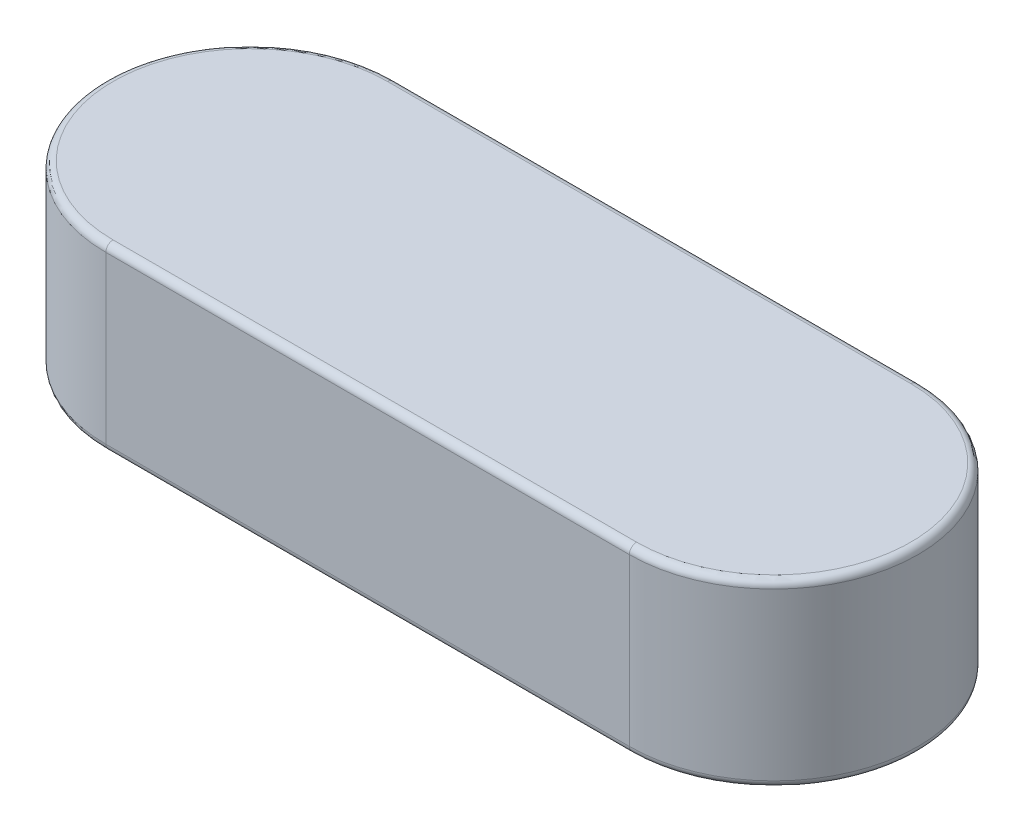
ISO-10303-21;
HEADER;
FILE_DESCRIPTION(('STEP AP214'),'2;1');
FILE_NAME('part.step','',(''),(''),'','','');
FILE_SCHEMA(('AUTOMOTIVE_DESIGN { 1 0 10303 214 1 1 1 1 }'));
ENDSEC;
DATA;
#1=APPLICATION_CONTEXT('core data for automotive mechanical design processes');
#2=APPLICATION_PROTOCOL_DEFINITION('international standard','automotive_design',2000,#1);
#3=PRODUCT_CONTEXT('',#1,'mechanical');
#4=PRODUCT('Part','Part','',(#3));
#5=PRODUCT_RELATED_PRODUCT_CATEGORY('part','',(#4));
#6=PRODUCT_DEFINITION_FORMATION('','',#4);
#7=PRODUCT_DEFINITION_CONTEXT('part definition',#1,'design');
#8=PRODUCT_DEFINITION('design','',#6,#7);
#9=PRODUCT_DEFINITION_SHAPE('','',#8);
#10=(LENGTH_UNIT() NAMED_UNIT(*) SI_UNIT(.MILLI.,.METRE.));
#11=(NAMED_UNIT(*) PLANE_ANGLE_UNIT() SI_UNIT($,.RADIAN.));
#12=(NAMED_UNIT(*) SI_UNIT($,.STERADIAN.) SOLID_ANGLE_UNIT());
#13=UNCERTAINTY_MEASURE_WITH_UNIT(LENGTH_MEASURE(1.E-05),#10,'distance_accuracy_value','');
#14=(GEOMETRIC_REPRESENTATION_CONTEXT(3) GLOBAL_UNCERTAINTY_ASSIGNED_CONTEXT((#13)) GLOBAL_UNIT_ASSIGNED_CONTEXT((#10,
#11,#12)) REPRESENTATION_CONTEXT('',''));
#15=CARTESIAN_POINT('',(0.,0.,0.));
#16=DIRECTION('',(0.,0.,1.));
#17=DIRECTION('',(1.,0.,0.));
#18=AXIS2_PLACEMENT_3D('',#15,#16,#17);
#19=CARTESIAN_POINT('',(-29.,10.,0.));
#20=DIRECTION('',(0.,-1.,0.));
#21=DIRECTION('',(0.,0.,-1.));
#22=AXIS2_PLACEMENT_3D('',#19,#20,#21);
#23=CYLINDRICAL_SURFACE('',#22,8.);
#24=DIRECTION('',(0.,-1.,0.));
#25=VECTOR('',#24,1.);
#26=CARTESIAN_POINT('',(-29.,10.,-8.));
#27=LINE('',#26,#25);
#28=CARTESIAN_POINT('',(-29.,9.6,-8.));
#29=VERTEX_POINT('',#28);
#30=CARTESIAN_POINT('',(-29.,0.399999999999999,-8.));
#31=VERTEX_POINT('',#30);
#32=EDGE_CURVE('E111',#29,#31,#27,.T.);
#33=ORIENTED_EDGE('',*,*,#32,.T.);
#34=CARTESIAN_POINT('',(-29.,0.399999999999999,0.));
#35=DIRECTION('',(0.,1.,0.));
#36=DIRECTION('',(0.,0.,1.));
#37=AXIS2_PLACEMENT_3D('',#34,#35,#36);
#38=CIRCLE('',#37,8.);
#39=CARTESIAN_POINT('',(-29.,0.399999999999999,8.));
#40=VERTEX_POINT('',#39);
#41=EDGE_CURVE('E119',#31,#40,#38,.T.);
#42=ORIENTED_EDGE('',*,*,#41,.T.);
#43=DIRECTION('',(0.,-1.,0.));
#44=VECTOR('',#43,1.);
#45=CARTESIAN_POINT('',(-29.,10.,8.));
#46=LINE('',#45,#44);
#47=CARTESIAN_POINT('',(-29.,9.6,8.));
#48=VERTEX_POINT('',#47);
#49=EDGE_CURVE('E113',#48,#40,#46,.T.);
#50=ORIENTED_EDGE('',*,*,#49,.F.);
#51=CARTESIAN_POINT('',(-29.,9.6,0.));
#52=DIRECTION('',(0.,1.,0.));
#53=DIRECTION('',(0.,0.,1.));
#54=AXIS2_PLACEMENT_3D('',#51,#52,#53);
#55=CIRCLE('',#54,8.);
#56=EDGE_CURVE('E109',#48,#29,#55,.F.);
#57=ORIENTED_EDGE('',*,*,#56,.T.);
#58=EDGE_LOOP('',(#33,#42,#50,#57));
#59=FACE_BOUND('',#58,.T.);
#60=ADVANCED_FACE('F39',(#59),#23,.T.);
#61=CARTESIAN_POINT('',(-29.,10.,8.));
#62=DIRECTION('',(0.,0.,-1.));
#63=DIRECTION('',(-1.,0.,0.));
#64=AXIS2_PLACEMENT_3D('',#61,#62,#63);
#65=PLANE('',#64);
#66=ORIENTED_EDGE('',*,*,#49,.T.);
#67=DIRECTION('',(1.,0.,0.));
#68=VECTOR('',#67,1.);
#69=CARTESIAN_POINT('',(-29.,0.399999999999999,8.));
#70=LINE('',#69,#68);
#71=CARTESIAN_POINT('',(0.,0.399999999999999,8.));
#72=VERTEX_POINT('',#71);
#73=EDGE_CURVE('E176',#40,#72,#70,.T.);
#74=ORIENTED_EDGE('',*,*,#73,.T.);
#75=DIRECTION('',(0.,-1.,0.));
#76=VECTOR('',#75,1.);
#77=CARTESIAN_POINT('',(0.,10.,8.));
#78=LINE('',#77,#76);
#79=CARTESIAN_POINT('',(0.,9.6,8.));
#80=VERTEX_POINT('',#79);
#81=EDGE_CURVE('E149',#80,#72,#78,.T.);
#82=ORIENTED_EDGE('',*,*,#81,.F.);
#83=DIRECTION('',(1.,0.,0.));
#84=VECTOR('',#83,1.);
#85=CARTESIAN_POINT('',(-29.,9.6,8.));
#86=LINE('',#85,#84);
#87=EDGE_CURVE('E173',#80,#48,#86,.F.);
#88=ORIENTED_EDGE('',*,*,#87,.T.);
#89=EDGE_LOOP('',(#66,#74,#82,#88));
#90=FACE_BOUND('',#89,.T.);
#91=ADVANCED_FACE('F212',(#90),#65,.F.);
#92=CARTESIAN_POINT('',(0.,10.,0.));
#93=DIRECTION('',(0.,-1.,0.));
#94=DIRECTION('',(0.,0.,-1.));
#95=AXIS2_PLACEMENT_3D('',#92,#93,#94);
#96=CYLINDRICAL_SURFACE('',#95,8.);
#97=ORIENTED_EDGE('',*,*,#81,.T.);
#98=CARTESIAN_POINT('',(0.,0.399999999999999,0.));
#99=DIRECTION('',(0.,1.,0.));
#100=DIRECTION('',(0.,0.,1.));
#101=AXIS2_PLACEMENT_3D('',#98,#99,#100);
#102=CIRCLE('',#101,8.);
#103=CARTESIAN_POINT('',(0.,0.399999999999999,-8.));
#104=VERTEX_POINT('',#103);
#105=EDGE_CURVE('E120',#72,#104,#102,.T.);
#106=ORIENTED_EDGE('',*,*,#105,.T.);
#107=DIRECTION('',(0.,-1.,0.));
#108=VECTOR('',#107,1.);
#109=CARTESIAN_POINT('',(0.,10.,-8.));
#110=LINE('',#109,#108);
#111=CARTESIAN_POINT('',(0.,9.6,-8.));
#112=VERTEX_POINT('',#111);
#113=EDGE_CURVE('E132',#112,#104,#110,.T.);
#114=ORIENTED_EDGE('',*,*,#113,.F.);
#115=CARTESIAN_POINT('',(0.,9.6,0.));
#116=DIRECTION('',(0.,1.,0.));
#117=DIRECTION('',(0.,0.,1.));
#118=AXIS2_PLACEMENT_3D('',#115,#116,#117);
#119=CIRCLE('',#118,8.);
#120=EDGE_CURVE('E165',#112,#80,#119,.F.);
#121=ORIENTED_EDGE('',*,*,#120,.T.);
#122=EDGE_LOOP('',(#97,#106,#114,#121));
#123=FACE_BOUND('',#122,.T.);
#124=ADVANCED_FACE('F210',(#123),#96,.T.);
#125=CARTESIAN_POINT('',(-29.,10.,-8.));
#126=DIRECTION('',(0.,0.,1.));
#127=DIRECTION('',(1.,0.,0.));
#128=AXIS2_PLACEMENT_3D('',#125,#126,#127);
#129=PLANE('',#128);
#130=ORIENTED_EDGE('',*,*,#113,.T.);
#131=DIRECTION('',(-1.,0.,0.));
#132=VECTOR('',#131,1.);
#133=CARTESIAN_POINT('',(-29.,0.399999999999999,-8.));
#134=LINE('',#133,#132);
#135=EDGE_CURVE('E130',#104,#31,#134,.T.);
#136=ORIENTED_EDGE('',*,*,#135,.T.);
#137=ORIENTED_EDGE('',*,*,#32,.F.);
#138=DIRECTION('',(-1.,0.,0.));
#139=VECTOR('',#138,1.);
#140=CARTESIAN_POINT('',(0.,9.6,-8.));
#141=LINE('',#140,#139);
#142=EDGE_CURVE('E127',#29,#112,#141,.F.);
#143=ORIENTED_EDGE('',*,*,#142,.T.);
#144=EDGE_LOOP('',(#130,#136,#137,#143));
#145=FACE_BOUND('',#144,.T.);
#146=ADVANCED_FACE('F125',(#145),#129,.F.);
#147=CARTESIAN_POINT('',(-29.,10.,0.));
#148=DIRECTION('',(0.,1.,0.));
#149=DIRECTION('',(0.,0.,1.));
#150=AXIS2_PLACEMENT_3D('',#147,#148,#149);
#151=PLANE('',#150);
#152=DIRECTION('',(1.,0.,0.));
#153=VECTOR('',#152,1.);
#154=CARTESIAN_POINT('',(0.,10.,7.6));
#155=LINE('',#154,#153);
#156=CARTESIAN_POINT('',(-29.,10.,7.6));
#157=VERTEX_POINT('',#156);
#158=CARTESIAN_POINT('',(0.,10.,7.6));
#159=VERTEX_POINT('',#158);
#160=EDGE_CURVE('E49',#157,#159,#155,.T.);
#161=ORIENTED_EDGE('',*,*,#160,.T.);
#162=CARTESIAN_POINT('',(0.,10.,0.));
#163=DIRECTION('',(0.,1.,0.));
#164=DIRECTION('',(0.,0.,1.));
#165=AXIS2_PLACEMENT_3D('',#162,#163,#164);
#166=CIRCLE('',#165,7.6);
#167=CARTESIAN_POINT('',(0.,10.,-7.6));
#168=VERTEX_POINT('',#167);
#169=EDGE_CURVE('E11',#159,#168,#166,.T.);
#170=ORIENTED_EDGE('',*,*,#169,.T.);
#171=DIRECTION('',(-1.,0.,0.));
#172=VECTOR('',#171,1.);
#173=CARTESIAN_POINT('',(-29.,10.,-7.6));
#174=LINE('',#173,#172);
#175=CARTESIAN_POINT('',(-29.,10.,-7.6));
#176=VERTEX_POINT('',#175);
#177=EDGE_CURVE('E181',#168,#176,#174,.T.);
#178=ORIENTED_EDGE('',*,*,#177,.T.);
#179=CARTESIAN_POINT('',(-29.,10.,0.));
#180=DIRECTION('',(0.,1.,0.));
#181=DIRECTION('',(0.,0.,1.));
#182=AXIS2_PLACEMENT_3D('',#179,#180,#181);
#183=CIRCLE('',#182,7.6);
#184=EDGE_CURVE('E138',#176,#157,#183,.T.);
#185=ORIENTED_EDGE('',*,*,#184,.T.);
#186=EDGE_LOOP('',(#161,#170,#178,#185));
#187=FACE_BOUND('',#186,.T.);
#188=ADVANCED_FACE('F237',(#187),#151,.T.);
#189=CARTESIAN_POINT('',(-29.,0.,0.));
#190=DIRECTION('',(0.,1.,0.));
#191=DIRECTION('',(0.,0.,1.));
#192=AXIS2_PLACEMENT_3D('',#189,#190,#191);
#193=PLANE('',#192);
#194=CARTESIAN_POINT('',(-29.,0.,0.));
#195=DIRECTION('',(0.,1.,0.));
#196=DIRECTION('',(0.,0.,1.));
#197=AXIS2_PLACEMENT_3D('',#194,#195,#196);
#198=CIRCLE('',#197,7.6);
#199=CARTESIAN_POINT('',(-29.,0.,7.6));
#200=VERTEX_POINT('',#199);
#201=CARTESIAN_POINT('',(-29.,0.,-7.6));
#202=VERTEX_POINT('',#201);
#203=EDGE_CURVE('E155',#200,#202,#198,.F.);
#204=ORIENTED_EDGE('',*,*,#203,.T.);
#205=DIRECTION('',(-1.,0.,0.));
#206=VECTOR('',#205,1.);
#207=CARTESIAN_POINT('',(-29.,0.,-7.6));
#208=LINE('',#207,#206);
#209=CARTESIAN_POINT('',(0.,0.,-7.6));
#210=VERTEX_POINT('',#209);
#211=EDGE_CURVE('E161',#202,#210,#208,.F.);
#212=ORIENTED_EDGE('',*,*,#211,.T.);
#213=CARTESIAN_POINT('',(0.,0.,0.));
#214=DIRECTION('',(0.,1.,0.));
#215=DIRECTION('',(0.,0.,1.));
#216=AXIS2_PLACEMENT_3D('',#213,#214,#215);
#217=CIRCLE('',#216,7.6);
#218=CARTESIAN_POINT('',(0.,0.,7.6));
#219=VERTEX_POINT('',#218);
#220=EDGE_CURVE('E158',#210,#219,#217,.F.);
#221=ORIENTED_EDGE('',*,*,#220,.T.);
#222=DIRECTION('',(1.,0.,0.));
#223=VECTOR('',#222,1.);
#224=CARTESIAN_POINT('',(-29.,0.,7.6));
#225=LINE('',#224,#223);
#226=EDGE_CURVE('E147',#219,#200,#225,.F.);
#227=ORIENTED_EDGE('',*,*,#226,.T.);
#228=EDGE_LOOP('',(#204,#212,#221,#227));
#229=FACE_BOUND('',#228,.T.);
#230=ADVANCED_FACE('F235',(#229),#193,.F.);
#231=CARTESIAN_POINT('',(-29.,0.399999999999999,7.6));
#232=DIRECTION('',(1.,0.,0.));
#233=DIRECTION('',(0.,0.,-1.));
#234=AXIS2_PLACEMENT_3D('',#231,#232,#233);
#235=CYLINDRICAL_SURFACE('',#234,0.4);
#236=CARTESIAN_POINT('',(-29.,0.4,7.6));
#237=DIRECTION('',(-1.,0.,0.));
#238=DIRECTION('',(0.,0.,1.));
#239=AXIS2_PLACEMENT_3D('',#236,#237,#238);
#240=CIRCLE('',#239,0.4);
#241=EDGE_CURVE('E192',#200,#40,#240,.T.);
#242=ORIENTED_EDGE('',*,*,#241,.F.);
#243=ORIENTED_EDGE('',*,*,#226,.F.);
#244=CARTESIAN_POINT('',(0.,0.399999999999999,7.6));
#245=DIRECTION('',(1.,0.,0.));
#246=DIRECTION('',(0.,0.,-1.));
#247=AXIS2_PLACEMENT_3D('',#244,#245,#246);
#248=CIRCLE('',#247,0.4);
#249=EDGE_CURVE('E133',#72,#219,#248,.T.);
#250=ORIENTED_EDGE('',*,*,#249,.F.);
#251=ORIENTED_EDGE('',*,*,#73,.F.);
#252=EDGE_LOOP('',(#242,#243,#250,#251));
#253=FACE_BOUND('',#252,.T.);
#254=ADVANCED_FACE('F232',(#253),#235,.T.);
#255=CARTESIAN_POINT('',(0.,0.399999999999999,0.));
#256=DIRECTION('',(0.,1.,0.));
#257=DIRECTION('',(0.,0.,1.));
#258=AXIS2_PLACEMENT_3D('',#255,#256,#257);
#259=TOROIDAL_SURFACE('',#258,7.6,0.4);
#260=ORIENTED_EDGE('',*,*,#249,.T.);
#261=ORIENTED_EDGE('',*,*,#220,.F.);
#262=CARTESIAN_POINT('',(0.,0.399999999999999,-7.6));
#263=DIRECTION('',(-1.,0.,0.));
#264=DIRECTION('',(0.,0.,1.));
#265=AXIS2_PLACEMENT_3D('',#262,#263,#264);
#266=CIRCLE('',#265,0.4);
#267=EDGE_CURVE('E189',#104,#210,#266,.T.);
#268=ORIENTED_EDGE('',*,*,#267,.F.);
#269=ORIENTED_EDGE('',*,*,#105,.F.);
#270=EDGE_LOOP('',(#260,#261,#268,#269));
#271=FACE_BOUND('',#270,.T.);
#272=ADVANCED_FACE('F221',(#271),#259,.T.);
#273=CARTESIAN_POINT('',(-29.,0.399999999999999,0.));
#274=DIRECTION('',(0.,1.,0.));
#275=DIRECTION('',(0.,0.,1.));
#276=AXIS2_PLACEMENT_3D('',#273,#274,#275);
#277=TOROIDAL_SURFACE('',#276,7.6,0.4);
#278=ORIENTED_EDGE('',*,*,#241,.T.);
#279=ORIENTED_EDGE('',*,*,#41,.F.);
#280=CARTESIAN_POINT('',(-29.,0.4,-7.6));
#281=DIRECTION('',(1.,0.,0.));
#282=DIRECTION('',(0.,0.,-1.));
#283=AXIS2_PLACEMENT_3D('',#280,#281,#282);
#284=CIRCLE('',#283,0.4);
#285=EDGE_CURVE('E186',#202,#31,#284,.T.);
#286=ORIENTED_EDGE('',*,*,#285,.F.);
#287=ORIENTED_EDGE('',*,*,#203,.F.);
#288=EDGE_LOOP('',(#278,#279,#286,#287));
#289=FACE_BOUND('',#288,.T.);
#290=ADVANCED_FACE('F229',(#289),#277,.T.);
#291=CARTESIAN_POINT('',(-29.,0.399999999999999,-7.6));
#292=DIRECTION('',(-1.,0.,0.));
#293=DIRECTION('',(0.,0.,1.));
#294=AXIS2_PLACEMENT_3D('',#291,#292,#293);
#295=CYLINDRICAL_SURFACE('',#294,0.4);
#296=ORIENTED_EDGE('',*,*,#267,.T.);
#297=ORIENTED_EDGE('',*,*,#211,.F.);
#298=ORIENTED_EDGE('',*,*,#285,.T.);
#299=ORIENTED_EDGE('',*,*,#135,.F.);
#300=EDGE_LOOP('',(#296,#297,#298,#299));
#301=FACE_BOUND('',#300,.T.);
#302=ADVANCED_FACE('F224',(#301),#295,.T.);
#303=CARTESIAN_POINT('',(-29.,9.6,0.));
#304=DIRECTION('',(0.,1.,0.));
#305=DIRECTION('',(0.,0.,1.));
#306=AXIS2_PLACEMENT_3D('',#303,#304,#305);
#307=TOROIDAL_SURFACE('',#306,7.6,0.4);
#308=CARTESIAN_POINT('',(-29.,9.6,-7.6));
#309=DIRECTION('',(1.,0.,0.));
#310=DIRECTION('',(0.,0.,-1.));
#311=AXIS2_PLACEMENT_3D('',#308,#309,#310);
#312=CIRCLE('',#311,0.4);
#313=EDGE_CURVE('E137',#29,#176,#312,.T.);
#314=ORIENTED_EDGE('',*,*,#313,.F.);
#315=ORIENTED_EDGE('',*,*,#56,.F.);
#316=CARTESIAN_POINT('',(-29.,9.6,7.6));
#317=DIRECTION('',(1.,0.,0.));
#318=DIRECTION('',(0.,0.,-1.));
#319=AXIS2_PLACEMENT_3D('',#316,#317,#318);
#320=CIRCLE('',#319,0.4);
#321=EDGE_CURVE('E43',#157,#48,#320,.T.);
#322=ORIENTED_EDGE('',*,*,#321,.F.);
#323=ORIENTED_EDGE('',*,*,#184,.F.);
#324=EDGE_LOOP('',(#314,#315,#322,#323));
#325=FACE_BOUND('',#324,.T.);
#326=ADVANCED_FACE('F41',(#325),#307,.T.);
#327=CARTESIAN_POINT('',(-29.,9.6,7.6));
#328=DIRECTION('',(-1.,0.,0.));
#329=DIRECTION('',(0.,0.,1.));
#330=AXIS2_PLACEMENT_3D('',#327,#328,#329);
#331=CYLINDRICAL_SURFACE('',#330,0.4);
#332=ORIENTED_EDGE('',*,*,#321,.T.);
#333=ORIENTED_EDGE('',*,*,#87,.F.);
#334=CARTESIAN_POINT('',(0.,9.6,7.6));
#335=DIRECTION('',(1.,0.,0.));
#336=DIRECTION('',(0.,0.,-1.));
#337=AXIS2_PLACEMENT_3D('',#334,#335,#336);
#338=CIRCLE('',#337,0.4);
#339=EDGE_CURVE('E141',#159,#80,#338,.T.);
#340=ORIENTED_EDGE('',*,*,#339,.F.);
#341=ORIENTED_EDGE('',*,*,#160,.F.);
#342=EDGE_LOOP('',(#332,#333,#340,#341));
#343=FACE_BOUND('',#342,.T.);
#344=ADVANCED_FACE('F205',(#343),#331,.T.);
#345=CARTESIAN_POINT('',(-29.,9.6,-7.6));
#346=DIRECTION('',(1.,0.,0.));
#347=DIRECTION('',(0.,0.,-1.));
#348=AXIS2_PLACEMENT_3D('',#345,#346,#347);
#349=CYLINDRICAL_SURFACE('',#348,0.4);
#350=ORIENTED_EDGE('',*,*,#313,.T.);
#351=ORIENTED_EDGE('',*,*,#177,.F.);
#352=CARTESIAN_POINT('',(0.,9.6,-7.6));
#353=DIRECTION('',(1.,0.,0.));
#354=DIRECTION('',(0.,0.,-1.));
#355=AXIS2_PLACEMENT_3D('',#352,#353,#354);
#356=CIRCLE('',#355,0.4);
#357=EDGE_CURVE('E63',#112,#168,#356,.T.);
#358=ORIENTED_EDGE('',*,*,#357,.F.);
#359=ORIENTED_EDGE('',*,*,#142,.F.);
#360=EDGE_LOOP('',(#350,#351,#358,#359));
#361=FACE_BOUND('',#360,.T.);
#362=ADVANCED_FACE('F142',(#361),#349,.T.);
#363=CARTESIAN_POINT('',(0.,9.6,0.));
#364=DIRECTION('',(0.,1.,0.));
#365=DIRECTION('',(0.,0.,1.));
#366=AXIS2_PLACEMENT_3D('',#363,#364,#365);
#367=TOROIDAL_SURFACE('',#366,7.6,0.4);
#368=ORIENTED_EDGE('',*,*,#339,.T.);
#369=ORIENTED_EDGE('',*,*,#120,.F.);
#370=ORIENTED_EDGE('',*,*,#357,.T.);
#371=ORIENTED_EDGE('',*,*,#169,.F.);
#372=EDGE_LOOP('',(#368,#369,#370,#371));
#373=FACE_BOUND('',#372,.T.);
#374=ADVANCED_FACE('F203',(#373),#367,.T.);
#375=CLOSED_SHELL('',(#60,#91,#124,#146,#188,#230,#254,#272,#290,#302,#326,#344,#362,#374));
#376=MANIFOLD_SOLID_BREP('B2',#375);
#377=ADVANCED_BREP_SHAPE_REPRESENTATION('',(#18,#376),#14);
#378=SHAPE_DEFINITION_REPRESENTATION(#9,#377);
ENDSEC;
END-ISO-10303-21;
